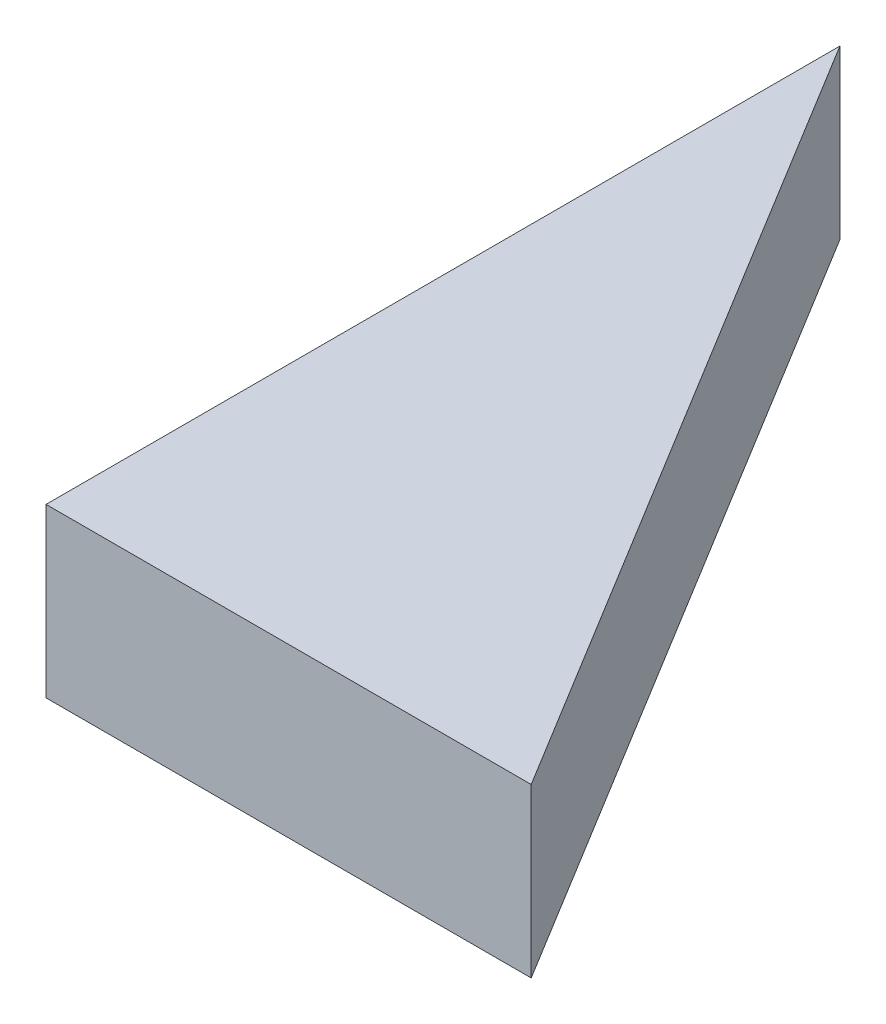
ISO-10303-21;
HEADER;
FILE_DESCRIPTION(('STEP AP214'),'2;1');
FILE_NAME('part.step','',(''),(''),'','','');
FILE_SCHEMA(('AUTOMOTIVE_DESIGN { 1 0 10303 214 1 1 1 1 }'));
ENDSEC;
DATA;
#1=APPLICATION_CONTEXT('core data for automotive mechanical design processes');
#2=APPLICATION_PROTOCOL_DEFINITION('international standard','automotive_design',2000,#1);
#3=PRODUCT_CONTEXT('',#1,'mechanical');
#4=PRODUCT('Part','Part','',(#3));
#5=PRODUCT_RELATED_PRODUCT_CATEGORY('part','',(#4));
#6=PRODUCT_DEFINITION_FORMATION('','',#4);
#7=PRODUCT_DEFINITION_CONTEXT('part definition',#1,'design');
#8=PRODUCT_DEFINITION('design','',#6,#7);
#9=PRODUCT_DEFINITION_SHAPE('','',#8);
#10=(LENGTH_UNIT() NAMED_UNIT(*) SI_UNIT(.MILLI.,.METRE.));
#11=(NAMED_UNIT(*) PLANE_ANGLE_UNIT() SI_UNIT($,.RADIAN.));
#12=(NAMED_UNIT(*) SI_UNIT($,.STERADIAN.) SOLID_ANGLE_UNIT());
#13=UNCERTAINTY_MEASURE_WITH_UNIT(LENGTH_MEASURE(1.E-05),#10,'distance_accuracy_value','');
#14=(GEOMETRIC_REPRESENTATION_CONTEXT(3) GLOBAL_UNCERTAINTY_ASSIGNED_CONTEXT((#13)) GLOBAL_UNIT_ASSIGNED_CONTEXT((#10,
#11,#12)) REPRESENTATION_CONTEXT('',''));
#15=CARTESIAN_POINT('',(0.,0.,0.));
#16=DIRECTION('',(0.,0.,1.));
#17=DIRECTION('',(1.,0.,0.));
#18=AXIS2_PLACEMENT_3D('',#15,#16,#17);
#19=CARTESIAN_POINT('',(0.,48.26,-228.6));
#20=DIRECTION('',(1.,0.,0.));
#21=DIRECTION('',(0.,0.,-1.));
#22=AXIS2_PLACEMENT_3D('',#19,#20,#21);
#23=PLANE('',#22);
#24=DIRECTION('',(0.,0.,1.));
#25=VECTOR('',#24,1.);
#26=CARTESIAN_POINT('',(0.,0.,-228.6));
#27=LINE('',#26,#25);
#28=CARTESIAN_POINT('',(0.,0.,-228.6));
#29=VERTEX_POINT('',#28);
#30=CARTESIAN_POINT('',(0.,0.,0.));
#31=VERTEX_POINT('',#30);
#32=EDGE_CURVE('E81',#29,#31,#27,.T.);
#33=ORIENTED_EDGE('',*,*,#32,.T.);
#34=DIRECTION('',(0.,-1.,0.));
#35=VECTOR('',#34,1.);
#36=CARTESIAN_POINT('',(0.,48.26,0.));
#37=LINE('',#36,#35);
#38=CARTESIAN_POINT('',(0.,48.26,0.));
#39=VERTEX_POINT('',#38);
#40=EDGE_CURVE('E11',#39,#31,#37,.T.);
#41=ORIENTED_EDGE('',*,*,#40,.F.);
#42=DIRECTION('',(0.,0.,1.));
#43=VECTOR('',#42,1.);
#44=CARTESIAN_POINT('',(0.,48.26,-228.6));
#45=LINE('',#44,#43);
#46=CARTESIAN_POINT('',(0.,48.26,-228.6));
#47=VERTEX_POINT('',#46);
#48=EDGE_CURVE('E74',#47,#39,#45,.T.);
#49=ORIENTED_EDGE('',*,*,#48,.F.);
#50=DIRECTION('',(0.,-1.,0.));
#51=VECTOR('',#50,1.);
#52=CARTESIAN_POINT('',(0.,48.26,-228.6));
#53=LINE('',#52,#51);
#54=EDGE_CURVE('E82',#47,#29,#53,.T.);
#55=ORIENTED_EDGE('',*,*,#54,.T.);
#56=EDGE_LOOP('',(#33,#41,#49,#55));
#57=FACE_BOUND('',#56,.T.);
#58=ADVANCED_FACE('F34',(#57),#23,.F.);
#59=CARTESIAN_POINT('',(0.,48.26,0.));
#60=DIRECTION('',(0.,0.,-1.));
#61=DIRECTION('',(-1.,0.,0.));
#62=AXIS2_PLACEMENT_3D('',#59,#60,#61);
#63=PLANE('',#62);
#64=DIRECTION('',(1.,0.,0.));
#65=VECTOR('',#64,1.);
#66=CARTESIAN_POINT('',(0.,0.,0.));
#67=LINE('',#66,#65);
#68=CARTESIAN_POINT('',(139.7,0.,0.));
#69=VERTEX_POINT('',#68);
#70=EDGE_CURVE('E62',#31,#69,#67,.T.);
#71=ORIENTED_EDGE('',*,*,#70,.T.);
#72=DIRECTION('',(0.,-1.,0.));
#73=VECTOR('',#72,1.);
#74=CARTESIAN_POINT('',(139.7,48.26,0.));
#75=LINE('',#74,#73);
#76=CARTESIAN_POINT('',(139.7,48.26,0.));
#77=VERTEX_POINT('',#76);
#78=EDGE_CURVE('E42',#77,#69,#75,.T.);
#79=ORIENTED_EDGE('',*,*,#78,.F.);
#80=DIRECTION('',(1.,0.,0.));
#81=VECTOR('',#80,1.);
#82=CARTESIAN_POINT('',(0.,48.26,0.));
#83=LINE('',#82,#81);
#84=EDGE_CURVE('E70',#39,#77,#83,.T.);
#85=ORIENTED_EDGE('',*,*,#84,.F.);
#86=ORIENTED_EDGE('',*,*,#40,.T.);
#87=EDGE_LOOP('',(#71,#79,#85,#86));
#88=FACE_BOUND('',#87,.T.);
#89=ADVANCED_FACE('F71',(#88),#63,.F.);
#90=CARTESIAN_POINT('',(139.7,48.26,0.));
#91=DIRECTION('',(-0.853281833651959,0.,0.521450009453975));
#92=DIRECTION('',(0.521450009453975,0.,0.853281833651959));
#93=AXIS2_PLACEMENT_3D('',#90,#91,#92);
#94=PLANE('',#93);
#95=DIRECTION('',(-0.521450009453975,0.,-0.853281833651959));
#96=VECTOR('',#95,1.);
#97=CARTESIAN_POINT('',(139.7,0.,0.));
#98=LINE('',#97,#96);
#99=EDGE_CURVE('E67',#69,#29,#98,.T.);
#100=ORIENTED_EDGE('',*,*,#99,.T.);
#101=ORIENTED_EDGE('',*,*,#54,.F.);
#102=DIRECTION('',(-0.521450009453975,0.,-0.853281833651959));
#103=VECTOR('',#102,1.);
#104=CARTESIAN_POINT('',(139.7,48.26,0.));
#105=LINE('',#104,#103);
#106=EDGE_CURVE('E50',#77,#47,#105,.T.);
#107=ORIENTED_EDGE('',*,*,#106,.F.);
#108=ORIENTED_EDGE('',*,*,#78,.T.);
#109=EDGE_LOOP('',(#100,#101,#107,#108));
#110=FACE_BOUND('',#109,.T.);
#111=ADVANCED_FACE('F89',(#110),#94,.F.);
#112=CARTESIAN_POINT('',(0.,48.26,0.));
#113=DIRECTION('',(0.,1.,0.));
#114=DIRECTION('',(0.,0.,1.));
#115=AXIS2_PLACEMENT_3D('',#112,#113,#114);
#116=PLANE('',#115);
#117=ORIENTED_EDGE('',*,*,#48,.T.);
#118=ORIENTED_EDGE('',*,*,#84,.T.);
#119=ORIENTED_EDGE('',*,*,#106,.T.);
#120=EDGE_LOOP('',(#117,#118,#119));
#121=FACE_BOUND('',#120,.T.);
#122=ADVANCED_FACE('F77',(#121),#116,.T.);
#123=CARTESIAN_POINT('',(0.,0.,0.));
#124=DIRECTION('',(0.,1.,0.));
#125=DIRECTION('',(0.,0.,1.));
#126=AXIS2_PLACEMENT_3D('',#123,#124,#125);
#127=PLANE('',#126);
#128=ORIENTED_EDGE('',*,*,#32,.F.);
#129=ORIENTED_EDGE('',*,*,#99,.F.);
#130=ORIENTED_EDGE('',*,*,#70,.F.);
#131=EDGE_LOOP('',(#128,#129,#130));
#132=FACE_BOUND('',#131,.T.);
#133=ADVANCED_FACE('F90',(#132),#127,.F.);
#134=CLOSED_SHELL('',(#58,#89,#111,#122,#133));
#135=MANIFOLD_SOLID_BREP('B2',#134);
#136=ADVANCED_BREP_SHAPE_REPRESENTATION('',(#18,#135),#14);
#137=SHAPE_DEFINITION_REPRESENTATION(#9,#136);
ENDSEC;
END-ISO-10303-21;
